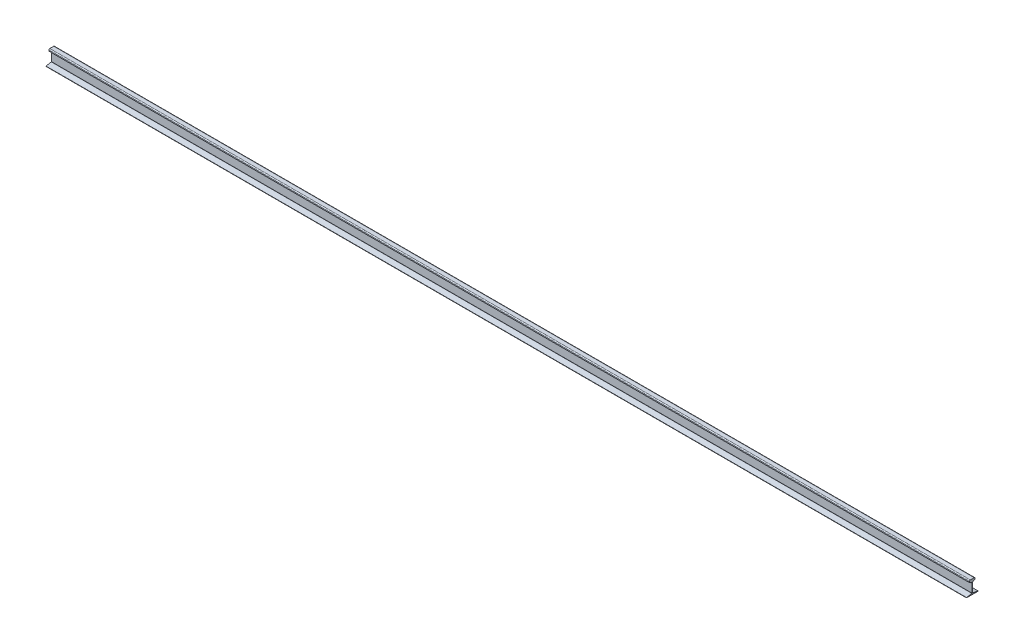
ISO-10303-21;
HEADER;
FILE_DESCRIPTION(('STEP AP214'),'2;1');
FILE_NAME('part.step','',(''),(''),'','','');
FILE_SCHEMA(('AUTOMOTIVE_DESIGN { 1 0 10303 214 1 1 1 1 }'));
ENDSEC;
DATA;
#1=APPLICATION_CONTEXT('core data for automotive mechanical design processes');
#2=APPLICATION_PROTOCOL_DEFINITION('international standard','automotive_design',2000,#1);
#3=PRODUCT_CONTEXT('',#1,'mechanical');
#4=PRODUCT('Part','Part','',(#3));
#5=PRODUCT_RELATED_PRODUCT_CATEGORY('part','',(#4));
#6=PRODUCT_DEFINITION_FORMATION('','',#4);
#7=PRODUCT_DEFINITION_CONTEXT('part definition',#1,'design');
#8=PRODUCT_DEFINITION('design','',#6,#7);
#9=PRODUCT_DEFINITION_SHAPE('','',#8);
#10=(LENGTH_UNIT() NAMED_UNIT(*) SI_UNIT(.MILLI.,.METRE.));
#11=(NAMED_UNIT(*) PLANE_ANGLE_UNIT() SI_UNIT($,.RADIAN.));
#12=(NAMED_UNIT(*) SI_UNIT($,.STERADIAN.) SOLID_ANGLE_UNIT());
#13=UNCERTAINTY_MEASURE_WITH_UNIT(LENGTH_MEASURE(1.E-05),#10,'distance_accuracy_value','');
#14=(GEOMETRIC_REPRESENTATION_CONTEXT(3) GLOBAL_UNCERTAINTY_ASSIGNED_CONTEXT((#13)) GLOBAL_UNIT_ASSIGNED_CONTEXT((#10,
#11,#12)) REPRESENTATION_CONTEXT('',''));
#15=CARTESIAN_POINT('',(0.,0.,0.));
#16=DIRECTION('',(0.,0.,1.));
#17=DIRECTION('',(1.,0.,0.));
#18=AXIS2_PLACEMENT_3D('',#15,#16,#17);
#19=CARTESIAN_POINT('',(1524.,0.,9.525));
#20=DIRECTION('',(0.,0.,-1.));
#21=DIRECTION('',(-1.,0.,0.));
#22=AXIS2_PLACEMENT_3D('',#19,#20,#21);
#23=PLANE('',#22);
#24=DIRECTION('',(0.,-1.,0.));
#25=VECTOR('',#24,1.);
#26=CARTESIAN_POINT('',(0.,0.,9.525));
#27=LINE('',#26,#25);
#28=CARTESIAN_POINT('',(0.,0.507999999999999,9.525));
#29=VERTEX_POINT('',#28);
#30=CARTESIAN_POINT('',(0.,0.,9.525));
#31=VERTEX_POINT('',#30);
#32=EDGE_CURVE('E188',#29,#31,#27,.T.);
#33=ORIENTED_EDGE('',*,*,#32,.T.);
#34=DIRECTION('',(-1.,0.,0.));
#35=VECTOR('',#34,1.);
#36=CARTESIAN_POINT('',(1524.,0.,9.525));
#37=LINE('',#36,#35);
#38=CARTESIAN_POINT('',(1524.,0.,9.525));
#39=VERTEX_POINT('',#38);
#40=EDGE_CURVE('E11',#39,#31,#37,.T.);
#41=ORIENTED_EDGE('',*,*,#40,.F.);
#42=DIRECTION('',(0.,-1.,0.));
#43=VECTOR('',#42,1.);
#44=CARTESIAN_POINT('',(1524.,0.,9.525));
#45=LINE('',#44,#43);
#46=CARTESIAN_POINT('',(1524.,0.507999999999999,9.525));
#47=VERTEX_POINT('',#46);
#48=EDGE_CURVE('E222',#47,#39,#45,.T.);
#49=ORIENTED_EDGE('',*,*,#48,.F.);
#50=DIRECTION('',(-1.,0.,0.));
#51=VECTOR('',#50,1.);
#52=CARTESIAN_POINT('',(1524.,0.507999999999999,9.525));
#53=LINE('',#52,#51);
#54=EDGE_CURVE('E184',#47,#29,#53,.T.);
#55=ORIENTED_EDGE('',*,*,#54,.T.);
#56=EDGE_LOOP('',(#33,#41,#49,#55));
#57=FACE_BOUND('',#56,.T.);
#58=ADVANCED_FACE('F32',(#57),#23,.F.);
#59=CARTESIAN_POINT('',(1524.,0.,-9.525));
#60=DIRECTION('',(0.,1.,0.));
#61=DIRECTION('',(0.,0.,1.));
#62=AXIS2_PLACEMENT_3D('',#59,#60,#61);
#63=PLANE('',#62);
#64=DIRECTION('',(0.,0.,-1.));
#65=VECTOR('',#64,1.);
#66=CARTESIAN_POINT('',(0.,0.,-9.525));
#67=LINE('',#66,#65);
#68=CARTESIAN_POINT('',(0.,0.,-9.525));
#69=VERTEX_POINT('',#68);
#70=EDGE_CURVE('E191',#31,#69,#67,.T.);
#71=ORIENTED_EDGE('',*,*,#70,.T.);
#72=DIRECTION('',(-1.,0.,0.));
#73=VECTOR('',#72,1.);
#74=CARTESIAN_POINT('',(1524.,0.,-9.525));
#75=LINE('',#74,#73);
#76=CARTESIAN_POINT('',(1524.,0.,-9.525));
#77=VERTEX_POINT('',#76);
#78=EDGE_CURVE('E40',#77,#69,#75,.T.);
#79=ORIENTED_EDGE('',*,*,#78,.F.);
#80=DIRECTION('',(0.,0.,-1.));
#81=VECTOR('',#80,1.);
#82=CARTESIAN_POINT('',(1524.,0.,-9.525));
#83=LINE('',#82,#81);
#84=EDGE_CURVE('E121',#39,#77,#83,.T.);
#85=ORIENTED_EDGE('',*,*,#84,.F.);
#86=ORIENTED_EDGE('',*,*,#40,.T.);
#87=EDGE_LOOP('',(#71,#79,#85,#86));
#88=FACE_BOUND('',#87,.T.);
#89=ADVANCED_FACE('F330',(#88),#63,.F.);
#90=CARTESIAN_POINT('',(1524.,0.,-9.525));
#91=DIRECTION('',(0.,0.,1.));
#92=DIRECTION('',(1.,0.,0.));
#93=AXIS2_PLACEMENT_3D('',#90,#91,#92);
#94=PLANE('',#93);
#95=DIRECTION('',(0.,1.,0.));
#96=VECTOR('',#95,1.);
#97=CARTESIAN_POINT('',(0.,0.,-9.525));
#98=LINE('',#97,#96);
#99=CARTESIAN_POINT('',(0.,0.508000000000013,-9.525));
#100=VERTEX_POINT('',#99);
#101=EDGE_CURVE('E193',#69,#100,#98,.T.);
#102=ORIENTED_EDGE('',*,*,#101,.T.);
#103=DIRECTION('',(-1.,0.,0.));
#104=VECTOR('',#103,1.);
#105=CARTESIAN_POINT('',(1524.,0.508000000000013,-9.525));
#106=LINE('',#105,#104);
#107=CARTESIAN_POINT('',(1524.,0.508000000000013,-9.525));
#108=VERTEX_POINT('',#107);
#109=EDGE_CURVE('E259',#108,#100,#106,.T.);
#110=ORIENTED_EDGE('',*,*,#109,.F.);
#111=DIRECTION('',(0.,1.,0.));
#112=VECTOR('',#111,1.);
#113=CARTESIAN_POINT('',(1524.,0.,-9.525));
#114=LINE('',#113,#112);
#115=EDGE_CURVE('E267',#77,#108,#114,.T.);
#116=ORIENTED_EDGE('',*,*,#115,.F.);
#117=ORIENTED_EDGE('',*,*,#78,.T.);
#118=EDGE_LOOP('',(#102,#110,#116,#117));
#119=FACE_BOUND('',#118,.T.);
#120=ADVANCED_FACE('F265',(#119),#94,.F.);
#121=CARTESIAN_POINT('',(1524.,0.508000000000013,-9.525));
#122=DIRECTION('',(0.,-0.983230800357741,0.182365548357893));
#123=DIRECTION('',(0.,-0.182365548357893,-0.983230800357741));
#124=AXIS2_PLACEMENT_3D('',#121,#122,#123);
#125=PLANE('',#124);
#126=DIRECTION('',(0.,0.182365548357893,0.983230800357741));
#127=VECTOR('',#126,1.);
#128=CARTESIAN_POINT('',(0.,0.508000000000013,-9.525));
#129=LINE('',#128,#127);
#130=CARTESIAN_POINT('',(0.,2.14191609249384,-0.715679150717094));
#131=VERTEX_POINT('',#130);
#132=EDGE_CURVE('E195',#100,#131,#129,.T.);
#133=ORIENTED_EDGE('',*,*,#132,.T.);
#134=DIRECTION('',(-1.,0.,0.));
#135=VECTOR('',#134,1.);
#136=CARTESIAN_POINT('',(1524.,2.14191609249384,-0.715679150717094));
#137=LINE('',#136,#135);
#138=CARTESIAN_POINT('',(1524.,2.14191609249384,-0.715679150717094));
#139=VERTEX_POINT('',#138);
#140=EDGE_CURVE('E256',#139,#131,#137,.T.);
#141=ORIENTED_EDGE('',*,*,#140,.F.);
#142=DIRECTION('',(0.,0.182365548357893,0.983230800357741));
#143=VECTOR('',#142,1.);
#144=CARTESIAN_POINT('',(1524.,0.508000000000013,-9.525));
#145=LINE('',#144,#143);
#146=EDGE_CURVE('E285',#108,#139,#145,.T.);
#147=ORIENTED_EDGE('',*,*,#146,.F.);
#148=ORIENTED_EDGE('',*,*,#109,.T.);
#149=EDGE_LOOP('',(#133,#141,#147,#148));
#150=FACE_BOUND('',#149,.T.);
#151=ADVANCED_FACE('F276',(#150),#125,.F.);
#152=CARTESIAN_POINT('',(1524.,2.39165671578471,-0.762));
#153=DIRECTION('',(-1.,0.,0.));
#154=DIRECTION('',(0.,0.,1.));
#155=AXIS2_PLACEMENT_3D('',#152,#153,#154);
#156=CYLINDRICAL_SURFACE('',#155,0.254000000000001);
#157=CARTESIAN_POINT('',(0.,2.39165671578471,-0.762));
#158=DIRECTION('',(-1.,0.,0.));
#159=DIRECTION('',(0.,0.,-1.));
#160=AXIS2_PLACEMENT_3D('',#157,#158,#159);
#161=CIRCLE('',#160,0.254000000000001);
#162=CARTESIAN_POINT('',(0.,2.39165671578471,-0.507999999999999));
#163=VERTEX_POINT('',#162);
#164=EDGE_CURVE('E197',#131,#163,#161,.T.);
#165=ORIENTED_EDGE('',*,*,#164,.T.);
#166=DIRECTION('',(-1.,0.,0.));
#167=VECTOR('',#166,1.);
#168=CARTESIAN_POINT('',(1524.,2.39165671578471,-0.507999999999999));
#169=LINE('',#168,#167);
#170=CARTESIAN_POINT('',(1524.,2.39165671578471,-0.507999999999999));
#171=VERTEX_POINT('',#170);
#172=EDGE_CURVE('E253',#171,#163,#169,.T.);
#173=ORIENTED_EDGE('',*,*,#172,.F.);
#174=CARTESIAN_POINT('',(1524.,2.39165671578471,-0.762));
#175=DIRECTION('',(-1.,0.,0.));
#176=DIRECTION('',(0.,0.,-1.));
#177=AXIS2_PLACEMENT_3D('',#174,#175,#176);
#178=CIRCLE('',#177,0.254000000000001);
#179=EDGE_CURVE('E282',#139,#171,#178,.T.);
#180=ORIENTED_EDGE('',*,*,#179,.F.);
#181=ORIENTED_EDGE('',*,*,#140,.T.);
#182=EDGE_LOOP('',(#165,#173,#180,#181));
#183=FACE_BOUND('',#182,.T.);
#184=ADVANCED_FACE('F280',(#183),#156,.F.);
#185=CARTESIAN_POINT('',(1524.,2.39165671578471,-0.508));
#186=DIRECTION('',(0.,0.,1.));
#187=DIRECTION('',(1.,0.,0.));
#188=AXIS2_PLACEMENT_3D('',#185,#186,#187);
#189=PLANE('',#188);
#190=DIRECTION('',(0.,1.,0.));
#191=VECTOR('',#190,1.);
#192=CARTESIAN_POINT('',(0.,2.39165671578471,-0.508));
#193=LINE('',#192,#191);
#194=CARTESIAN_POINT('',(0.,16.1426346305,-0.508));
#195=VERTEX_POINT('',#194);
#196=EDGE_CURVE('E199',#163,#195,#193,.T.);
#197=ORIENTED_EDGE('',*,*,#196,.T.);
#198=DIRECTION('',(-1.,0.,0.));
#199=VECTOR('',#198,1.);
#200=CARTESIAN_POINT('',(1524.,16.1426346305,-0.508));
#201=LINE('',#200,#199);
#202=CARTESIAN_POINT('',(1524.,16.1426346305,-0.508));
#203=VERTEX_POINT('',#202);
#204=EDGE_CURVE('E250',#203,#195,#201,.T.);
#205=ORIENTED_EDGE('',*,*,#204,.F.);
#206=DIRECTION('',(0.,1.,0.));
#207=VECTOR('',#206,1.);
#208=CARTESIAN_POINT('',(1524.,2.39165671578471,-0.508));
#209=LINE('',#208,#207);
#210=EDGE_CURVE('E284',#171,#203,#209,.T.);
#211=ORIENTED_EDGE('',*,*,#210,.F.);
#212=ORIENTED_EDGE('',*,*,#172,.T.);
#213=EDGE_LOOP('',(#197,#205,#211,#212));
#214=FACE_BOUND('',#213,.T.);
#215=ADVANCED_FACE('F343',(#214),#189,.F.);
#216=CARTESIAN_POINT('',(1524.,16.1426346305,-3.048));
#217=DIRECTION('',(-1.,0.,0.));
#218=DIRECTION('',(0.,0.,1.));
#219=AXIS2_PLACEMENT_3D('',#216,#217,#218);
#220=CYLINDRICAL_SURFACE('',#219,2.54);
#221=CARTESIAN_POINT('',(0.,16.1426346305,-3.048));
#222=DIRECTION('',(-1.,0.,0.));
#223=DIRECTION('',(0.,0.,1.));
#224=AXIS2_PLACEMENT_3D('',#221,#222,#223);
#225=CIRCLE('',#224,2.54);
#226=CARTESIAN_POINT('',(0.,18.5250171110204,-2.16717441198074));
#227=VERTEX_POINT('',#226);
#228=EDGE_CURVE('E201',#195,#227,#225,.T.);
#229=ORIENTED_EDGE('',*,*,#228,.T.);
#230=DIRECTION('',(-1.,0.,0.));
#231=VECTOR('',#230,1.);
#232=CARTESIAN_POINT('',(1524.,18.5250171110204,-2.16717441198074));
#233=LINE('',#232,#231);
#234=CARTESIAN_POINT('',(1524.,18.5250171110204,-2.16717441198074));
#235=VERTEX_POINT('',#234);
#236=EDGE_CURVE('E247',#235,#227,#233,.T.);
#237=ORIENTED_EDGE('',*,*,#236,.F.);
#238=CARTESIAN_POINT('',(1524.,16.1426346305,-3.048));
#239=DIRECTION('',(-1.,0.,0.));
#240=DIRECTION('',(0.,0.,1.));
#241=AXIS2_PLACEMENT_3D('',#238,#239,#240);
#242=CIRCLE('',#241,2.54);
#243=EDGE_CURVE('E287',#203,#235,#242,.T.);
#244=ORIENTED_EDGE('',*,*,#243,.F.);
#245=ORIENTED_EDGE('',*,*,#204,.T.);
#246=EDGE_LOOP('',(#229,#237,#244,#245));
#247=FACE_BOUND('',#246,.T.);
#248=ADVANCED_FACE('F346',(#247),#220,.F.);
#249=CARTESIAN_POINT('',(1524.,18.5250171110204,-2.16717441198074));
#250=DIRECTION('',(0.,0.937945858472597,0.346781727566638));
#251=DIRECTION('',(0.,-0.346781727566638,0.937945858472598));
#252=AXIS2_PLACEMENT_3D('',#249,#250,#251);
#253=PLANE('',#252);
#254=DIRECTION('',(0.,0.346781727566638,-0.937945858472597));
#255=VECTOR('',#254,1.);
#256=CARTESIAN_POINT('',(0.,18.5250171110204,-2.16717441198074));
#257=LINE('',#256,#255);
#258=CARTESIAN_POINT('',(0.,19.4564,-4.6863));
#259=VERTEX_POINT('',#258);
#260=EDGE_CURVE('E203',#227,#259,#257,.T.);
#261=ORIENTED_EDGE('',*,*,#260,.T.);
#262=DIRECTION('',(-1.,0.,0.));
#263=VECTOR('',#262,1.);
#264=CARTESIAN_POINT('',(1524.,19.4564,-4.6863));
#265=LINE('',#264,#263);
#266=CARTESIAN_POINT('',(1524.,19.4564,-4.6863));
#267=VERTEX_POINT('',#266);
#268=EDGE_CURVE('E244',#267,#259,#265,.T.);
#269=ORIENTED_EDGE('',*,*,#268,.F.);
#270=DIRECTION('',(0.,0.346781727566638,-0.937945858472597));
#271=VECTOR('',#270,1.);
#272=CARTESIAN_POINT('',(1524.,18.5250171110204,-2.16717441198074));
#273=LINE('',#272,#271);
#274=EDGE_CURVE('E293',#235,#267,#273,.T.);
#275=ORIENTED_EDGE('',*,*,#274,.F.);
#276=ORIENTED_EDGE('',*,*,#236,.T.);
#277=EDGE_LOOP('',(#261,#269,#275,#276));
#278=FACE_BOUND('',#277,.T.);
#279=ADVANCED_FACE('F350',(#278),#253,.F.);
#280=CARTESIAN_POINT('',(1524.,19.4564,-4.6863));
#281=DIRECTION('',(0.,0.,1.));
#282=DIRECTION('',(0.,-1.,0.));
#283=AXIS2_PLACEMENT_3D('',#280,#281,#282);
#284=PLANE('',#283);
#285=DIRECTION('',(0.,1.,0.));
#286=VECTOR('',#285,1.);
#287=CARTESIAN_POINT('',(0.,19.4564,-4.6863));
#288=LINE('',#287,#286);
#289=CARTESIAN_POINT('',(0.,21.1074,-4.6863));
#290=VERTEX_POINT('',#289);
#291=EDGE_CURVE('E205',#259,#290,#288,.T.);
#292=ORIENTED_EDGE('',*,*,#291,.T.);
#293=DIRECTION('',(-1.,0.,0.));
#294=VECTOR('',#293,1.);
#295=CARTESIAN_POINT('',(1524.,21.1074,-4.6863));
#296=LINE('',#295,#294);
#297=CARTESIAN_POINT('',(1524.,21.1074,-4.6863));
#298=VERTEX_POINT('',#297);
#299=EDGE_CURVE('E241',#298,#290,#296,.T.);
#300=ORIENTED_EDGE('',*,*,#299,.F.);
#301=DIRECTION('',(0.,1.,0.));
#302=VECTOR('',#301,1.);
#303=CARTESIAN_POINT('',(1524.,19.4564,-4.6863));
#304=LINE('',#303,#302);
#305=EDGE_CURVE('E295',#267,#298,#304,.T.);
#306=ORIENTED_EDGE('',*,*,#305,.F.);
#307=ORIENTED_EDGE('',*,*,#268,.T.);
#308=EDGE_LOOP('',(#292,#300,#306,#307));
#309=FACE_BOUND('',#308,.T.);
#310=ADVANCED_FACE('F354',(#309),#284,.F.);
#311=CARTESIAN_POINT('',(1524.,21.1074,-3.1623));
#312=DIRECTION('',(-1.,0.,0.));
#313=DIRECTION('',(0.,0.,1.));
#314=AXIS2_PLACEMENT_3D('',#311,#312,#313);
#315=CYLINDRICAL_SURFACE('',#314,1.524);
#316=CARTESIAN_POINT('',(0.,21.1074,-3.1623));
#317=DIRECTION('',(1.,0.,0.));
#318=DIRECTION('',(0.,0.,-1.));
#319=AXIS2_PLACEMENT_3D('',#316,#317,#318);
#320=CIRCLE('',#319,1.524);
#321=CARTESIAN_POINT('',(0.,22.6314,-3.16229999999999));
#322=VERTEX_POINT('',#321);
#323=EDGE_CURVE('E207',#290,#322,#320,.T.);
#324=ORIENTED_EDGE('',*,*,#323,.T.);
#325=DIRECTION('',(-1.,0.,0.));
#326=VECTOR('',#325,1.);
#327=CARTESIAN_POINT('',(1524.,22.6314,-3.16229999999999));
#328=LINE('',#327,#326);
#329=CARTESIAN_POINT('',(1524.,22.6314,-3.16229999999999));
#330=VERTEX_POINT('',#329);
#331=EDGE_CURVE('E238',#330,#322,#328,.T.);
#332=ORIENTED_EDGE('',*,*,#331,.F.);
#333=CARTESIAN_POINT('',(1524.,21.1074,-3.1623));
#334=DIRECTION('',(1.,0.,0.));
#335=DIRECTION('',(0.,0.,-1.));
#336=AXIS2_PLACEMENT_3D('',#333,#334,#335);
#337=CIRCLE('',#336,1.524);
#338=EDGE_CURVE('E297',#298,#330,#337,.T.);
#339=ORIENTED_EDGE('',*,*,#338,.F.);
#340=ORIENTED_EDGE('',*,*,#299,.T.);
#341=EDGE_LOOP('',(#324,#332,#339,#340));
#342=FACE_BOUND('',#341,.T.);
#343=ADVANCED_FACE('F358',(#342),#315,.T.);
#344=CARTESIAN_POINT('',(1524.,22.6314,3.16229999999999));
#345=DIRECTION('',(0.,-1.,0.));
#346=DIRECTION('',(0.,0.,-1.));
#347=AXIS2_PLACEMENT_3D('',#344,#345,#346);
#348=PLANE('',#347);
#349=DIRECTION('',(0.,0.,1.));
#350=VECTOR('',#349,1.);
#351=CARTESIAN_POINT('',(0.,22.6314,3.16229999999999));
#352=LINE('',#351,#350);
#353=CARTESIAN_POINT('',(0.,22.6314,3.16229999999999));
#354=VERTEX_POINT('',#353);
#355=EDGE_CURVE('E209',#322,#354,#352,.T.);
#356=ORIENTED_EDGE('',*,*,#355,.T.);
#357=DIRECTION('',(-1.,0.,0.));
#358=VECTOR('',#357,1.);
#359=CARTESIAN_POINT('',(1524.,22.6314,3.16229999999999));
#360=LINE('',#359,#358);
#361=CARTESIAN_POINT('',(1524.,22.6314,3.16229999999999));
#362=VERTEX_POINT('',#361);
#363=EDGE_CURVE('E235',#362,#354,#360,.T.);
#364=ORIENTED_EDGE('',*,*,#363,.F.);
#365=DIRECTION('',(0.,0.,1.));
#366=VECTOR('',#365,1.);
#367=CARTESIAN_POINT('',(1524.,22.6314,3.16229999999999));
#368=LINE('',#367,#366);
#369=EDGE_CURVE('E299',#330,#362,#368,.T.);
#370=ORIENTED_EDGE('',*,*,#369,.F.);
#371=ORIENTED_EDGE('',*,*,#331,.T.);
#372=EDGE_LOOP('',(#356,#364,#370,#371));
#373=FACE_BOUND('',#372,.T.);
#374=ADVANCED_FACE('F362',(#373),#348,.F.);
#375=CARTESIAN_POINT('',(1524.,21.1074,3.1623));
#376=DIRECTION('',(-1.,0.,0.));
#377=DIRECTION('',(0.,0.,1.));
#378=AXIS2_PLACEMENT_3D('',#375,#376,#377);
#379=CYLINDRICAL_SURFACE('',#378,1.524);
#380=CARTESIAN_POINT('',(0.,21.1074,3.1623));
#381=DIRECTION('',(1.,0.,0.));
#382=DIRECTION('',(0.,0.,-1.));
#383=AXIS2_PLACEMENT_3D('',#380,#381,#382);
#384=CIRCLE('',#383,1.524);
#385=CARTESIAN_POINT('',(0.,21.1074,4.6863));
#386=VERTEX_POINT('',#385);
#387=EDGE_CURVE('E211',#354,#386,#384,.T.);
#388=ORIENTED_EDGE('',*,*,#387,.T.);
#389=DIRECTION('',(-1.,0.,0.));
#390=VECTOR('',#389,1.);
#391=CARTESIAN_POINT('',(1524.,21.1074,4.6863));
#392=LINE('',#391,#390);
#393=CARTESIAN_POINT('',(1524.,21.1074,4.6863));
#394=VERTEX_POINT('',#393);
#395=EDGE_CURVE('E232',#394,#386,#392,.T.);
#396=ORIENTED_EDGE('',*,*,#395,.F.);
#397=CARTESIAN_POINT('',(1524.,21.1074,3.1623));
#398=DIRECTION('',(1.,0.,0.));
#399=DIRECTION('',(0.,0.,-1.));
#400=AXIS2_PLACEMENT_3D('',#397,#398,#399);
#401=CIRCLE('',#400,1.524);
#402=EDGE_CURVE('E301',#362,#394,#401,.T.);
#403=ORIENTED_EDGE('',*,*,#402,.F.);
#404=ORIENTED_EDGE('',*,*,#363,.T.);
#405=EDGE_LOOP('',(#388,#396,#403,#404));
#406=FACE_BOUND('',#405,.T.);
#407=ADVANCED_FACE('F366',(#406),#379,.T.);
#408=CARTESIAN_POINT('',(1524.,19.4564,4.6863));
#409=DIRECTION('',(0.,0.,-1.));
#410=DIRECTION('',(0.,1.,0.));
#411=AXIS2_PLACEMENT_3D('',#408,#409,#410);
#412=PLANE('',#411);
#413=DIRECTION('',(0.,-1.,0.));
#414=VECTOR('',#413,1.);
#415=CARTESIAN_POINT('',(0.,19.4564,4.6863));
#416=LINE('',#415,#414);
#417=CARTESIAN_POINT('',(0.,19.4564,4.6863));
#418=VERTEX_POINT('',#417);
#419=EDGE_CURVE('E213',#386,#418,#416,.T.);
#420=ORIENTED_EDGE('',*,*,#419,.T.);
#421=DIRECTION('',(-1.,0.,0.));
#422=VECTOR('',#421,1.);
#423=CARTESIAN_POINT('',(1524.,19.4564,4.6863));
#424=LINE('',#423,#422);
#425=CARTESIAN_POINT('',(1524.,19.4564,4.6863));
#426=VERTEX_POINT('',#425);
#427=EDGE_CURVE('E229',#426,#418,#424,.T.);
#428=ORIENTED_EDGE('',*,*,#427,.F.);
#429=DIRECTION('',(0.,-1.,0.));
#430=VECTOR('',#429,1.);
#431=CARTESIAN_POINT('',(1524.,19.4564,4.6863));
#432=LINE('',#431,#430);
#433=EDGE_CURVE('E303',#394,#426,#432,.T.);
#434=ORIENTED_EDGE('',*,*,#433,.F.);
#435=ORIENTED_EDGE('',*,*,#395,.T.);
#436=EDGE_LOOP('',(#420,#428,#434,#435));
#437=FACE_BOUND('',#436,.T.);
#438=ADVANCED_FACE('F370',(#437),#412,.F.);
#439=CARTESIAN_POINT('',(1524.,18.5250171110204,2.16717441198074));
#440=DIRECTION('',(0.,0.937945858472597,-0.346781727566638));
#441=DIRECTION('',(0.,0.346781727566638,0.937945858472598));
#442=AXIS2_PLACEMENT_3D('',#439,#440,#441);
#443=PLANE('',#442);
#444=DIRECTION('',(0.,-0.346781727566638,-0.937945858472597));
#445=VECTOR('',#444,1.);
#446=CARTESIAN_POINT('',(0.,18.5250171110204,2.16717441198074));
#447=LINE('',#446,#445);
#448=CARTESIAN_POINT('',(0.,18.5250171110204,2.16717441198074));
#449=VERTEX_POINT('',#448);
#450=EDGE_CURVE('E215',#418,#449,#447,.T.);
#451=ORIENTED_EDGE('',*,*,#450,.T.);
#452=DIRECTION('',(-1.,0.,0.));
#453=VECTOR('',#452,1.);
#454=CARTESIAN_POINT('',(1524.,18.5250171110204,2.16717441198074));
#455=LINE('',#454,#453);
#456=CARTESIAN_POINT('',(1524.,18.5250171110204,2.16717441198074));
#457=VERTEX_POINT('',#456);
#458=EDGE_CURVE('E226',#457,#449,#455,.T.);
#459=ORIENTED_EDGE('',*,*,#458,.F.);
#460=DIRECTION('',(0.,-0.346781727566638,-0.937945858472597));
#461=VECTOR('',#460,1.);
#462=CARTESIAN_POINT('',(1524.,18.5250171110204,2.16717441198074));
#463=LINE('',#462,#461);
#464=EDGE_CURVE('E305',#426,#457,#463,.T.);
#465=ORIENTED_EDGE('',*,*,#464,.F.);
#466=ORIENTED_EDGE('',*,*,#427,.T.);
#467=EDGE_LOOP('',(#451,#459,#465,#466));
#468=FACE_BOUND('',#467,.T.);
#469=ADVANCED_FACE('F311',(#468),#443,.F.);
#470=CARTESIAN_POINT('',(1524.,16.1426346305,3.048));
#471=DIRECTION('',(-1.,0.,0.));
#472=DIRECTION('',(0.,0.,1.));
#473=AXIS2_PLACEMENT_3D('',#470,#471,#472);
#474=CYLINDRICAL_SURFACE('',#473,2.54);
#475=CARTESIAN_POINT('',(0.,16.1426346305,3.048));
#476=DIRECTION('',(-1.,0.,0.));
#477=DIRECTION('',(0.,0.,-1.));
#478=AXIS2_PLACEMENT_3D('',#475,#476,#477);
#479=CIRCLE('',#478,2.54);
#480=CARTESIAN_POINT('',(0.,16.1426346305,0.508000000000001));
#481=VERTEX_POINT('',#480);
#482=EDGE_CURVE('E217',#449,#481,#479,.T.);
#483=ORIENTED_EDGE('',*,*,#482,.T.);
#484=DIRECTION('',(-1.,0.,0.));
#485=VECTOR('',#484,1.);
#486=CARTESIAN_POINT('',(1524.,16.1426346305,0.508000000000001));
#487=LINE('',#486,#485);
#488=CARTESIAN_POINT('',(1524.,16.1426346305,0.508000000000001));
#489=VERTEX_POINT('',#488);
#490=EDGE_CURVE('E179',#489,#481,#487,.T.);
#491=ORIENTED_EDGE('',*,*,#490,.F.);
#492=CARTESIAN_POINT('',(1524.,16.1426346305,3.048));
#493=DIRECTION('',(-1.,0.,0.));
#494=DIRECTION('',(0.,0.,-1.));
#495=AXIS2_PLACEMENT_3D('',#492,#493,#494);
#496=CIRCLE('',#495,2.54);
#497=EDGE_CURVE('E170',#457,#489,#496,.T.);
#498=ORIENTED_EDGE('',*,*,#497,.F.);
#499=ORIENTED_EDGE('',*,*,#458,.T.);
#500=EDGE_LOOP('',(#483,#491,#498,#499));
#501=FACE_BOUND('',#500,.T.);
#502=ADVANCED_FACE('F315',(#501),#474,.F.);
#503=CARTESIAN_POINT('',(1524.,2.39165671578471,0.508));
#504=DIRECTION('',(0.,0.,-1.));
#505=DIRECTION('',(-1.,0.,0.));
#506=AXIS2_PLACEMENT_3D('',#503,#504,#505);
#507=PLANE('',#506);
#508=DIRECTION('',(0.,-1.,0.));
#509=VECTOR('',#508,1.);
#510=CARTESIAN_POINT('',(0.,2.39165671578471,0.508));
#511=LINE('',#510,#509);
#512=CARTESIAN_POINT('',(0.,2.39165671578471,0.508));
#513=VERTEX_POINT('',#512);
#514=EDGE_CURVE('E178',#481,#513,#511,.T.);
#515=ORIENTED_EDGE('',*,*,#514,.T.);
#516=DIRECTION('',(-1.,0.,0.));
#517=VECTOR('',#516,1.);
#518=CARTESIAN_POINT('',(1524.,2.39165671578471,0.508));
#519=LINE('',#518,#517);
#520=CARTESIAN_POINT('',(1524.,2.39165671578471,0.508));
#521=VERTEX_POINT('',#520);
#522=EDGE_CURVE('E175',#521,#513,#519,.T.);
#523=ORIENTED_EDGE('',*,*,#522,.F.);
#524=DIRECTION('',(0.,-1.,0.));
#525=VECTOR('',#524,1.);
#526=CARTESIAN_POINT('',(1524.,2.39165671578471,0.508));
#527=LINE('',#526,#525);
#528=EDGE_CURVE('E164',#489,#521,#527,.T.);
#529=ORIENTED_EDGE('',*,*,#528,.F.);
#530=ORIENTED_EDGE('',*,*,#490,.T.);
#531=EDGE_LOOP('',(#515,#523,#529,#530));
#532=FACE_BOUND('',#531,.T.);
#533=ADVANCED_FACE('F176',(#532),#507,.F.);
#534=CARTESIAN_POINT('',(1524.,2.39165671578471,0.762));
#535=DIRECTION('',(-1.,0.,0.));
#536=DIRECTION('',(0.,0.,1.));
#537=AXIS2_PLACEMENT_3D('',#534,#535,#536);
#538=CYLINDRICAL_SURFACE('',#537,0.254000000000001);
#539=CARTESIAN_POINT('',(0.,2.39165671578471,0.762));
#540=DIRECTION('',(-1.,0.,0.));
#541=DIRECTION('',(0.,0.,1.));
#542=AXIS2_PLACEMENT_3D('',#539,#540,#541);
#543=CIRCLE('',#542,0.254000000000001);
#544=CARTESIAN_POINT('',(0.,2.14191609249384,0.715679150717095));
#545=VERTEX_POINT('',#544);
#546=EDGE_CURVE('E107',#513,#545,#543,.T.);
#547=ORIENTED_EDGE('',*,*,#546,.T.);
#548=DIRECTION('',(-1.,0.,0.));
#549=VECTOR('',#548,1.);
#550=CARTESIAN_POINT('',(1524.,2.14191609249384,0.715679150717095));
#551=LINE('',#550,#549);
#552=CARTESIAN_POINT('',(1524.,2.14191609249384,0.715679150717095));
#553=VERTEX_POINT('',#552);
#554=EDGE_CURVE('E180',#553,#545,#551,.T.);
#555=ORIENTED_EDGE('',*,*,#554,.F.);
#556=CARTESIAN_POINT('',(1524.,2.39165671578471,0.762));
#557=DIRECTION('',(-1.,0.,0.));
#558=DIRECTION('',(0.,0.,1.));
#559=AXIS2_PLACEMENT_3D('',#556,#557,#558);
#560=CIRCLE('',#559,0.254000000000001);
#561=EDGE_CURVE('E168',#521,#553,#560,.T.);
#562=ORIENTED_EDGE('',*,*,#561,.F.);
#563=ORIENTED_EDGE('',*,*,#522,.T.);
#564=EDGE_LOOP('',(#547,#555,#562,#563));
#565=FACE_BOUND('',#564,.T.);
#566=ADVANCED_FACE('F182',(#565),#538,.F.);
#567=CARTESIAN_POINT('',(1524.,0.507999999999999,9.525));
#568=DIRECTION('',(0.,-0.983230800357741,-0.182365548357895));
#569=DIRECTION('',(0.,0.182365548357895,-0.983230800357741));
#570=AXIS2_PLACEMENT_3D('',#567,#568,#569);
#571=PLANE('',#570);
#572=DIRECTION('',(0.,-0.182365548357895,0.983230800357741));
#573=VECTOR('',#572,1.);
#574=CARTESIAN_POINT('',(0.,0.507999999999999,9.525));
#575=LINE('',#574,#573);
#576=EDGE_CURVE('E113',#545,#29,#575,.T.);
#577=ORIENTED_EDGE('',*,*,#576,.T.);
#578=ORIENTED_EDGE('',*,*,#54,.F.);
#579=DIRECTION('',(0.,-0.182365548357895,0.983230800357741));
#580=VECTOR('',#579,1.);
#581=CARTESIAN_POINT('',(1524.,0.507999999999999,9.525));
#582=LINE('',#581,#580);
#583=EDGE_CURVE('E48',#553,#47,#582,.T.);
#584=ORIENTED_EDGE('',*,*,#583,.F.);
#585=ORIENTED_EDGE('',*,*,#554,.T.);
#586=EDGE_LOOP('',(#577,#578,#584,#585));
#587=FACE_BOUND('',#586,.T.);
#588=ADVANCED_FACE('F319',(#587),#571,.F.);
#589=CARTESIAN_POINT('',(1524.,2.39165671578471,0.762));
#590=DIRECTION('',(-1.,0.,0.));
#591=DIRECTION('',(0.,0.,1.));
#592=AXIS2_PLACEMENT_3D('',#589,#590,#591);
#593=PLANE('',#592);
#594=ORIENTED_EDGE('',*,*,#48,.T.);
#595=ORIENTED_EDGE('',*,*,#84,.T.);
#596=ORIENTED_EDGE('',*,*,#115,.T.);
#597=ORIENTED_EDGE('',*,*,#146,.T.);
#598=ORIENTED_EDGE('',*,*,#179,.T.);
#599=ORIENTED_EDGE('',*,*,#210,.T.);
#600=ORIENTED_EDGE('',*,*,#243,.T.);
#601=ORIENTED_EDGE('',*,*,#274,.T.);
#602=ORIENTED_EDGE('',*,*,#305,.T.);
#603=ORIENTED_EDGE('',*,*,#338,.T.);
#604=ORIENTED_EDGE('',*,*,#369,.T.);
#605=ORIENTED_EDGE('',*,*,#402,.T.);
#606=ORIENTED_EDGE('',*,*,#433,.T.);
#607=ORIENTED_EDGE('',*,*,#464,.T.);
#608=ORIENTED_EDGE('',*,*,#497,.T.);
#609=ORIENTED_EDGE('',*,*,#528,.T.);
#610=ORIENTED_EDGE('',*,*,#561,.T.);
#611=ORIENTED_EDGE('',*,*,#583,.T.);
#612=EDGE_LOOP('',(#594,#595,#596,#597,#598,#599,#600,#601,#602,#603,#604,#605,#606,#607,#608,
#609,#610,#611));
#613=FACE_BOUND('',#612,.T.);
#614=ADVANCED_FACE('F166',(#613),#593,.F.);
#615=CARTESIAN_POINT('',(0.,2.39165671578471,0.762));
#616=DIRECTION('',(-1.,0.,0.));
#617=DIRECTION('',(0.,0.,1.));
#618=AXIS2_PLACEMENT_3D('',#615,#616,#617);
#619=PLANE('',#618);
#620=ORIENTED_EDGE('',*,*,#32,.F.);
#621=ORIENTED_EDGE('',*,*,#576,.F.);
#622=ORIENTED_EDGE('',*,*,#546,.F.);
#623=ORIENTED_EDGE('',*,*,#514,.F.);
#624=ORIENTED_EDGE('',*,*,#482,.F.);
#625=ORIENTED_EDGE('',*,*,#450,.F.);
#626=ORIENTED_EDGE('',*,*,#419,.F.);
#627=ORIENTED_EDGE('',*,*,#387,.F.);
#628=ORIENTED_EDGE('',*,*,#355,.F.);
#629=ORIENTED_EDGE('',*,*,#323,.F.);
#630=ORIENTED_EDGE('',*,*,#291,.F.);
#631=ORIENTED_EDGE('',*,*,#260,.F.);
#632=ORIENTED_EDGE('',*,*,#228,.F.);
#633=ORIENTED_EDGE('',*,*,#196,.F.);
#634=ORIENTED_EDGE('',*,*,#164,.F.);
#635=ORIENTED_EDGE('',*,*,#132,.F.);
#636=ORIENTED_EDGE('',*,*,#101,.F.);
#637=ORIENTED_EDGE('',*,*,#70,.F.);
#638=EDGE_LOOP('',(#620,#621,#622,#623,#624,#625,#626,#627,#628,#629,#630,#631,#632,#633,#634,
#635,#636,#637));
#639=FACE_BOUND('',#638,.T.);
#640=ADVANCED_FACE('F271',(#639),#619,.T.);
#641=CLOSED_SHELL('',(#58,#89,#120,#151,#184,#215,#248,#279,#310,#343,#374,#407,#438,#469,#502,
#533,#566,#588,#614,#640));
#642=MANIFOLD_SOLID_BREP('B2',#641);
#643=ADVANCED_BREP_SHAPE_REPRESENTATION('',(#18,#642),#14);
#644=SHAPE_DEFINITION_REPRESENTATION(#9,#643);
ENDSEC;
END-ISO-10303-21;
